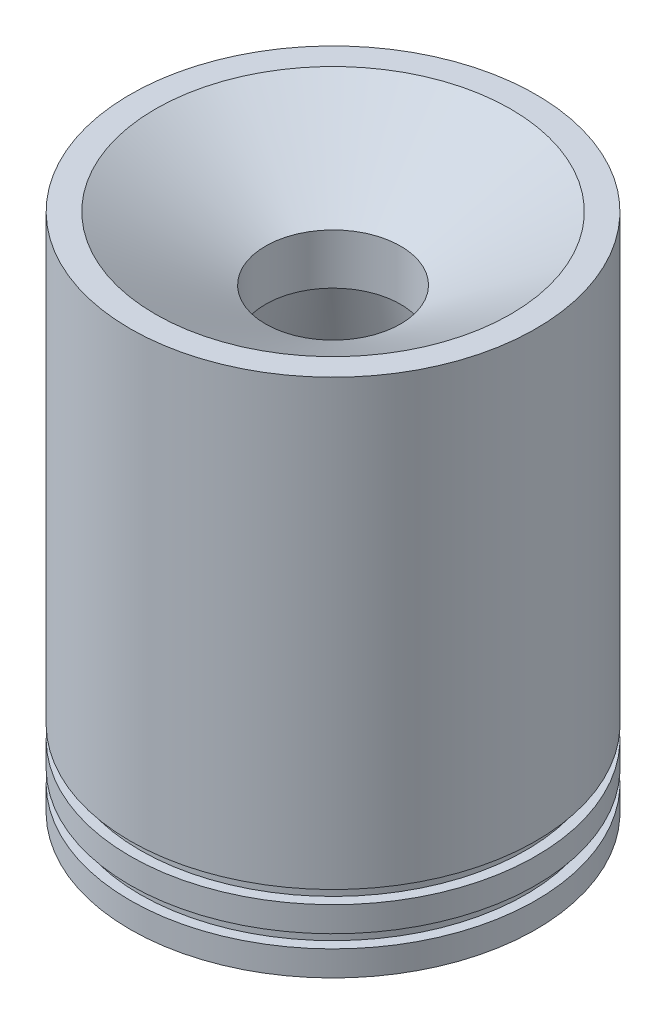
ISO-10303-21;
HEADER;
FILE_DESCRIPTION(('STEP AP214'),'2;1');
FILE_NAME('part.step','',(''),(''),'','','');
FILE_SCHEMA(('AUTOMOTIVE_DESIGN { 1 0 10303 214 1 1 1 1 }'));
ENDSEC;
DATA;
#1=APPLICATION_CONTEXT('core data for automotive mechanical design processes');
#2=APPLICATION_PROTOCOL_DEFINITION('international standard','automotive_design',2000,#1);
#3=PRODUCT_CONTEXT('',#1,'mechanical');
#4=PRODUCT('Part','Part','',(#3));
#5=PRODUCT_RELATED_PRODUCT_CATEGORY('part','',(#4));
#6=PRODUCT_DEFINITION_FORMATION('','',#4);
#7=PRODUCT_DEFINITION_CONTEXT('part definition',#1,'design');
#8=PRODUCT_DEFINITION('design','',#6,#7);
#9=PRODUCT_DEFINITION_SHAPE('','',#8);
#10=(LENGTH_UNIT() NAMED_UNIT(*) SI_UNIT(.MILLI.,.METRE.));
#11=(NAMED_UNIT(*) PLANE_ANGLE_UNIT() SI_UNIT($,.RADIAN.));
#12=(NAMED_UNIT(*) SI_UNIT($,.STERADIAN.) SOLID_ANGLE_UNIT());
#13=UNCERTAINTY_MEASURE_WITH_UNIT(LENGTH_MEASURE(1.E-05),#10,'distance_accuracy_value','');
#14=(GEOMETRIC_REPRESENTATION_CONTEXT(3) GLOBAL_UNCERTAINTY_ASSIGNED_CONTEXT((#13)) GLOBAL_UNIT_ASSIGNED_CONTEXT((#10,
#11,#12)) REPRESENTATION_CONTEXT('',''));
#15=CARTESIAN_POINT('',(0.,0.,0.));
#16=DIRECTION('',(0.,0.,1.));
#17=DIRECTION('',(1.,0.,0.));
#18=AXIS2_PLACEMENT_3D('',#15,#16,#17);
#19=CARTESIAN_POINT('',(-44.7802,0.,0.));
#20=DIRECTION('',(0.,1.,0.));
#21=DIRECTION('',(0.,0.,1.));
#22=AXIS2_PLACEMENT_3D('',#19,#20,#21);
#23=PLANE('',#22);
#24=CARTESIAN_POINT('',(0.,0.,0.));
#25=DIRECTION('',(0.,1.,0.));
#26=DIRECTION('',(0.,0.,1.));
#27=AXIS2_PLACEMENT_3D('',#24,#25,#26);
#28=CIRCLE('',#27,51.1302);
#29=CARTESIAN_POINT('',(0.,0.,51.1302));
#30=VERTEX_POINT('',#29);
#31=EDGE_CURVE('E10',#30,#30,#28,.T.);
#32=ORIENTED_EDGE('',*,*,#31,.T.);
#33=EDGE_LOOP('',(#32));
#34=FACE_BOUND('',#33,.T.);
#35=CARTESIAN_POINT('',(0.,0.,0.));
#36=DIRECTION('',(0.,1.,0.));
#37=DIRECTION('',(0.,0.,1.));
#38=AXIS2_PLACEMENT_3D('',#35,#36,#37);
#39=CIRCLE('',#38,44.7802);
#40=CARTESIAN_POINT('',(0.,0.,44.7802));
#41=VERTEX_POINT('',#40);
#42=EDGE_CURVE('E96',#41,#41,#39,.T.);
#43=ORIENTED_EDGE('',*,*,#42,.F.);
#44=EDGE_LOOP('',(#43));
#45=FACE_BOUND('',#44,.T.);
#46=ADVANCED_FACE('F37',(#34,#45),#23,.T.);
#47=CARTESIAN_POINT('',(0.,0.,0.));
#48=DIRECTION('',(0.,1.,0.));
#49=DIRECTION('',(0.,0.,1.));
#50=AXIS2_PLACEMENT_3D('',#47,#48,#49);
#51=CYLINDRICAL_SURFACE('',#50,51.1302);
#52=CARTESIAN_POINT('',(0.,-111.802131396525,0.));
#53=DIRECTION('',(0.,1.,0.));
#54=DIRECTION('',(0.,0.,1.));
#55=AXIS2_PLACEMENT_3D('',#52,#53,#54);
#56=CIRCLE('',#55,51.1302);
#57=CARTESIAN_POINT('',(0.,-111.802131396525,51.1302));
#58=VERTEX_POINT('',#57);
#59=EDGE_CURVE('E44',#58,#58,#56,.T.);
#60=ORIENTED_EDGE('',*,*,#59,.T.);
#61=EDGE_LOOP('',(#60));
#62=FACE_BOUND('',#61,.T.);
#63=ORIENTED_EDGE('',*,*,#31,.F.);
#64=EDGE_LOOP('',(#63));
#65=FACE_BOUND('',#64,.T.);
#66=ADVANCED_FACE('F105',(#62,#65),#51,.T.);
#67=CARTESIAN_POINT('',(-48.5902,-111.802131396525,0.));
#68=DIRECTION('',(0.,-1.,0.));
#69=DIRECTION('',(0.,0.,-1.));
#70=AXIS2_PLACEMENT_3D('',#67,#68,#69);
#71=PLANE('',#70);
#72=CARTESIAN_POINT('',(0.,-111.802131396525,0.));
#73=DIRECTION('',(0.,1.,0.));
#74=DIRECTION('',(0.,0.,1.));
#75=AXIS2_PLACEMENT_3D('',#72,#73,#74);
#76=CIRCLE('',#75,48.5902);
#77=CARTESIAN_POINT('',(0.,-111.802131396525,48.5902));
#78=VERTEX_POINT('',#77);
#79=EDGE_CURVE('E49',#78,#78,#76,.T.);
#80=ORIENTED_EDGE('',*,*,#79,.T.);
#81=EDGE_LOOP('',(#80));
#82=FACE_BOUND('',#81,.T.);
#83=ORIENTED_EDGE('',*,*,#59,.F.);
#84=EDGE_LOOP('',(#83));
#85=FACE_BOUND('',#84,.T.);
#86=ADVANCED_FACE('F109',(#82,#85),#71,.T.);
#87=CARTESIAN_POINT('',(0.,0.,0.));
#88=DIRECTION('',(0.,1.,0.));
#89=DIRECTION('',(0.,0.,1.));
#90=AXIS2_PLACEMENT_3D('',#87,#88,#89);
#91=CYLINDRICAL_SURFACE('',#90,48.5902);
#92=CARTESIAN_POINT('',(0.,-115.104131396525,0.));
#93=DIRECTION('',(0.,1.,0.));
#94=DIRECTION('',(0.,0.,1.));
#95=AXIS2_PLACEMENT_3D('',#92,#93,#94);
#96=CIRCLE('',#95,48.5902);
#97=CARTESIAN_POINT('',(0.,-115.104131396525,48.5902));
#98=VERTEX_POINT('',#97);
#99=EDGE_CURVE('E54',#98,#98,#96,.T.);
#100=ORIENTED_EDGE('',*,*,#99,.T.);
#101=EDGE_LOOP('',(#100));
#102=FACE_BOUND('',#101,.T.);
#103=ORIENTED_EDGE('',*,*,#79,.F.);
#104=EDGE_LOOP('',(#103));
#105=FACE_BOUND('',#104,.T.);
#106=ADVANCED_FACE('F113',(#102,#105),#91,.T.);
#107=CARTESIAN_POINT('',(-51.1302,-115.104131396525,0.));
#108=DIRECTION('',(0.,1.,0.));
#109=DIRECTION('',(0.,0.,1.));
#110=AXIS2_PLACEMENT_3D('',#107,#108,#109);
#111=PLANE('',#110);
#112=CARTESIAN_POINT('',(0.,-115.104131396525,0.));
#113=DIRECTION('',(0.,1.,0.));
#114=DIRECTION('',(0.,0.,1.));
#115=AXIS2_PLACEMENT_3D('',#112,#113,#114);
#116=CIRCLE('',#115,51.1302);
#117=CARTESIAN_POINT('',(0.,-115.104131396525,51.1302));
#118=VERTEX_POINT('',#117);
#119=EDGE_CURVE('E60',#118,#118,#116,.T.);
#120=ORIENTED_EDGE('',*,*,#119,.T.);
#121=EDGE_LOOP('',(#120));
#122=FACE_BOUND('',#121,.T.);
#123=ORIENTED_EDGE('',*,*,#99,.F.);
#124=EDGE_LOOP('',(#123));
#125=FACE_BOUND('',#124,.T.);
#126=ADVANCED_FACE('F120',(#122,#125),#111,.T.);
#127=CARTESIAN_POINT('',(0.,0.,0.));
#128=DIRECTION('',(0.,1.,0.));
#129=DIRECTION('',(0.,0.,1.));
#130=AXIS2_PLACEMENT_3D('',#127,#128,#129);
#131=CYLINDRICAL_SURFACE('',#130,51.1302);
#132=CARTESIAN_POINT('',(0.,-121.454131396525,0.));
#133=DIRECTION('',(0.,1.,0.));
#134=DIRECTION('',(0.,0.,1.));
#135=AXIS2_PLACEMENT_3D('',#132,#133,#134);
#136=CIRCLE('',#135,51.1302);
#137=CARTESIAN_POINT('',(0.,-121.454131396525,51.1302));
#138=VERTEX_POINT('',#137);
#139=EDGE_CURVE('E64',#138,#138,#136,.T.);
#140=ORIENTED_EDGE('',*,*,#139,.T.);
#141=EDGE_LOOP('',(#140));
#142=FACE_BOUND('',#141,.T.);
#143=ORIENTED_EDGE('',*,*,#119,.F.);
#144=EDGE_LOOP('',(#143));
#145=FACE_BOUND('',#144,.T.);
#146=ADVANCED_FACE('F124',(#142,#145),#131,.T.);
#147=CARTESIAN_POINT('',(-48.5902,-121.454131396525,0.));
#148=DIRECTION('',(0.,-1.,0.));
#149=DIRECTION('',(0.,0.,-1.));
#150=AXIS2_PLACEMENT_3D('',#147,#148,#149);
#151=PLANE('',#150);
#152=CARTESIAN_POINT('',(0.,-121.454131396525,0.));
#153=DIRECTION('',(0.,1.,0.));
#154=DIRECTION('',(0.,0.,1.));
#155=AXIS2_PLACEMENT_3D('',#152,#153,#154);
#156=CIRCLE('',#155,48.5902);
#157=CARTESIAN_POINT('',(0.,-121.454131396525,48.5902));
#158=VERTEX_POINT('',#157);
#159=EDGE_CURVE('E68',#158,#158,#156,.T.);
#160=ORIENTED_EDGE('',*,*,#159,.T.);
#161=EDGE_LOOP('',(#160));
#162=FACE_BOUND('',#161,.T.);
#163=ORIENTED_EDGE('',*,*,#139,.F.);
#164=EDGE_LOOP('',(#163));
#165=FACE_BOUND('',#164,.T.);
#166=ADVANCED_FACE('F128',(#162,#165),#151,.T.);
#167=CARTESIAN_POINT('',(0.,0.,0.));
#168=DIRECTION('',(0.,1.,0.));
#169=DIRECTION('',(0.,0.,1.));
#170=AXIS2_PLACEMENT_3D('',#167,#168,#169);
#171=CYLINDRICAL_SURFACE('',#170,48.5902);
#172=CARTESIAN_POINT('',(0.,-124.756131396525,0.));
#173=DIRECTION('',(0.,1.,0.));
#174=DIRECTION('',(0.,0.,1.));
#175=AXIS2_PLACEMENT_3D('',#172,#173,#174);
#176=CIRCLE('',#175,48.5902);
#177=CARTESIAN_POINT('',(0.,-124.756131396525,48.5902));
#178=VERTEX_POINT('',#177);
#179=EDGE_CURVE('E72',#178,#178,#176,.T.);
#180=ORIENTED_EDGE('',*,*,#179,.T.);
#181=EDGE_LOOP('',(#180));
#182=FACE_BOUND('',#181,.T.);
#183=ORIENTED_EDGE('',*,*,#159,.F.);
#184=EDGE_LOOP('',(#183));
#185=FACE_BOUND('',#184,.T.);
#186=ADVANCED_FACE('F132',(#182,#185),#171,.T.);
#187=CARTESIAN_POINT('',(-51.1302,-124.756131396525,0.));
#188=DIRECTION('',(0.,1.,0.));
#189=DIRECTION('',(0.,0.,1.));
#190=AXIS2_PLACEMENT_3D('',#187,#188,#189);
#191=PLANE('',#190);
#192=CARTESIAN_POINT('',(0.,-124.756131396525,0.));
#193=DIRECTION('',(0.,1.,0.));
#194=DIRECTION('',(0.,0.,1.));
#195=AXIS2_PLACEMENT_3D('',#192,#193,#194);
#196=CIRCLE('',#195,51.1302);
#197=CARTESIAN_POINT('',(0.,-124.756131396525,51.1302));
#198=VERTEX_POINT('',#197);
#199=EDGE_CURVE('E76',#198,#198,#196,.T.);
#200=ORIENTED_EDGE('',*,*,#199,.T.);
#201=EDGE_LOOP('',(#200));
#202=FACE_BOUND('',#201,.T.);
#203=ORIENTED_EDGE('',*,*,#179,.F.);
#204=EDGE_LOOP('',(#203));
#205=FACE_BOUND('',#204,.T.);
#206=ADVANCED_FACE('F136',(#202,#205),#191,.T.);
#207=CARTESIAN_POINT('',(0.,0.,0.));
#208=DIRECTION('',(0.,1.,0.));
#209=DIRECTION('',(0.,0.,1.));
#210=AXIS2_PLACEMENT_3D('',#207,#208,#209);
#211=CYLINDRICAL_SURFACE('',#210,51.1302);
#212=CARTESIAN_POINT('',(0.,-131.106131396525,0.));
#213=DIRECTION('',(0.,1.,0.));
#214=DIRECTION('',(0.,0.,1.));
#215=AXIS2_PLACEMENT_3D('',#212,#213,#214);
#216=CIRCLE('',#215,51.1302);
#217=CARTESIAN_POINT('',(0.,-131.106131396525,51.1302));
#218=VERTEX_POINT('',#217);
#219=EDGE_CURVE('E80',#218,#218,#216,.T.);
#220=ORIENTED_EDGE('',*,*,#219,.T.);
#221=EDGE_LOOP('',(#220));
#222=FACE_BOUND('',#221,.T.);
#223=ORIENTED_EDGE('',*,*,#199,.F.);
#224=EDGE_LOOP('',(#223));
#225=FACE_BOUND('',#224,.T.);
#226=ADVANCED_FACE('F140',(#222,#225),#211,.T.);
#227=CARTESIAN_POINT('',(-51.1302,-131.106131396525,0.));
#228=DIRECTION('',(0.,-1.,0.));
#229=DIRECTION('',(0.,0.,-1.));
#230=AXIS2_PLACEMENT_3D('',#227,#228,#229);
#231=PLANE('',#230);
#232=CARTESIAN_POINT('',(0.,-131.106131396525,0.));
#233=DIRECTION('',(0.,1.,0.));
#234=DIRECTION('',(0.,0.,1.));
#235=AXIS2_PLACEMENT_3D('',#232,#233,#234);
#236=CIRCLE('',#235,44.45);
#237=CARTESIAN_POINT('',(0.,-131.106131396525,44.45));
#238=VERTEX_POINT('',#237);
#239=EDGE_CURVE('E84',#238,#238,#236,.T.);
#240=ORIENTED_EDGE('',*,*,#239,.T.);
#241=EDGE_LOOP('',(#240));
#242=FACE_BOUND('',#241,.T.);
#243=ORIENTED_EDGE('',*,*,#219,.F.);
#244=EDGE_LOOP('',(#243));
#245=FACE_BOUND('',#244,.T.);
#246=ADVANCED_FACE('F144',(#242,#245),#231,.T.);
#247=CARTESIAN_POINT('',(0.,-131.106131396525,0.));
#248=DIRECTION('',(0.,-1.,0.));
#249=DIRECTION('',(0.,0.,-1.));
#250=AXIS2_PLACEMENT_3D('',#247,#248,#249);
#251=CONICAL_SURFACE('',#250,44.45,0.26179938779915);
#252=CARTESIAN_POINT('',(0.,-28.7285136432961,0.));
#253=DIRECTION('',(0.,1.,0.));
#254=DIRECTION('',(0.,0.,1.));
#255=AXIS2_PLACEMENT_3D('',#252,#253,#254);
#256=CIRCLE('',#255,17.018);
#257=CARTESIAN_POINT('',(0.,-28.7285136432961,17.018));
#258=VERTEX_POINT('',#257);
#259=EDGE_CURVE('E88',#258,#258,#256,.T.);
#260=ORIENTED_EDGE('',*,*,#259,.T.);
#261=EDGE_LOOP('',(#260));
#262=FACE_BOUND('',#261,.T.);
#263=ORIENTED_EDGE('',*,*,#239,.F.);
#264=EDGE_LOOP('',(#263));
#265=FACE_BOUND('',#264,.T.);
#266=ADVANCED_FACE('F148',(#262,#265),#251,.F.);
#267=CARTESIAN_POINT('',(0.,0.,0.));
#268=DIRECTION('',(0.,1.,0.));
#269=DIRECTION('',(0.,0.,1.));
#270=AXIS2_PLACEMENT_3D('',#267,#268,#269);
#271=CYLINDRICAL_SURFACE('',#270,17.018);
#272=CARTESIAN_POINT('',(0.,-16.0285136432961,0.));
#273=DIRECTION('',(0.,1.,0.));
#274=DIRECTION('',(0.,0.,1.));
#275=AXIS2_PLACEMENT_3D('',#272,#273,#274);
#276=CIRCLE('',#275,17.018);
#277=CARTESIAN_POINT('',(0.,-16.0285136432961,17.018));
#278=VERTEX_POINT('',#277);
#279=EDGE_CURVE('E92',#278,#278,#276,.T.);
#280=ORIENTED_EDGE('',*,*,#279,.T.);
#281=EDGE_LOOP('',(#280));
#282=FACE_BOUND('',#281,.T.);
#283=ORIENTED_EDGE('',*,*,#259,.F.);
#284=EDGE_LOOP('',(#283));
#285=FACE_BOUND('',#284,.T.);
#286=ADVANCED_FACE('F152',(#282,#285),#271,.F.);
#287=CARTESIAN_POINT('',(0.,-16.0285136432961,0.));
#288=DIRECTION('',(0.,1.,0.));
#289=DIRECTION('',(0.,0.,1.));
#290=AXIS2_PLACEMENT_3D('',#287,#288,#289);
#291=CONICAL_SURFACE('',#290,17.018,1.0471975511966);
#292=ORIENTED_EDGE('',*,*,#42,.T.);
#293=EDGE_LOOP('',(#292));
#294=FACE_BOUND('',#293,.T.);
#295=ORIENTED_EDGE('',*,*,#279,.F.);
#296=EDGE_LOOP('',(#295));
#297=FACE_BOUND('',#296,.T.);
#298=ADVANCED_FACE('F101',(#294,#297),#291,.F.);
#299=CLOSED_SHELL('',(#46,#66,#86,#106,#126,#146,#166,#186,#206,#226,#246,#266,#286,#298));
#300=MANIFOLD_SOLID_BREP('B2',#299);
#301=ADVANCED_BREP_SHAPE_REPRESENTATION('',(#18,#300),#14);
#302=SHAPE_DEFINITION_REPRESENTATION(#9,#301);
ENDSEC;
END-ISO-10303-21;
